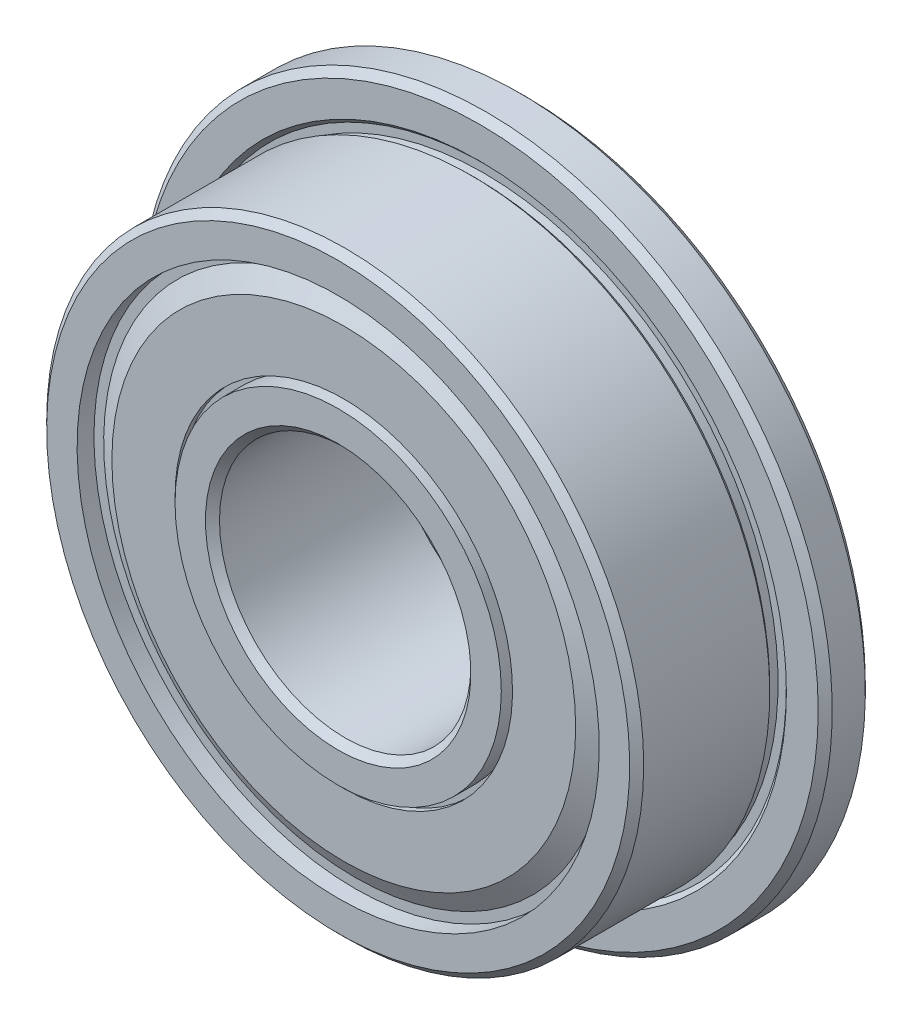
ISO-10303-21;
HEADER;
FILE_DESCRIPTION(('STEP AP214'),'2;1');
FILE_NAME('part.step','',(''),(''),'','','');
FILE_SCHEMA(('AUTOMOTIVE_DESIGN { 1 0 10303 214 1 1 1 1 }'));
ENDSEC;
DATA;
#1=APPLICATION_CONTEXT('core data for automotive mechanical design processes');
#2=APPLICATION_PROTOCOL_DEFINITION('international standard','automotive_design',2000,#1);
#3=PRODUCT_CONTEXT('',#1,'mechanical');
#4=PRODUCT('Part','Part','',(#3));
#5=PRODUCT_RELATED_PRODUCT_CATEGORY('part','',(#4));
#6=PRODUCT_DEFINITION_FORMATION('','',#4);
#7=PRODUCT_DEFINITION_CONTEXT('part definition',#1,'design');
#8=PRODUCT_DEFINITION('design','',#6,#7);
#9=PRODUCT_DEFINITION_SHAPE('','',#8);
#10=(LENGTH_UNIT() NAMED_UNIT(*) SI_UNIT(.MILLI.,.METRE.));
#11=(NAMED_UNIT(*) PLANE_ANGLE_UNIT() SI_UNIT($,.RADIAN.));
#12=(NAMED_UNIT(*) SI_UNIT($,.STERADIAN.) SOLID_ANGLE_UNIT());
#13=UNCERTAINTY_MEASURE_WITH_UNIT(LENGTH_MEASURE(1.E-05),#10,'distance_accuracy_value','');
#14=(GEOMETRIC_REPRESENTATION_CONTEXT(3) GLOBAL_UNCERTAINTY_ASSIGNED_CONTEXT((#13)) GLOBAL_UNIT_ASSIGNED_CONTEXT((#10,
#11,#12)) REPRESENTATION_CONTEXT('',''));
#15=CARTESIAN_POINT('',(0.,0.,0.));
#16=DIRECTION('',(0.,0.,1.));
#17=DIRECTION('',(1.,0.,0.));
#18=AXIS2_PLACEMENT_3D('',#15,#16,#17);
#19=CARTESIAN_POINT('',(0.,0.,0.));
#20=DIRECTION('',(0.,0.,1.));
#21=DIRECTION('',(0.,-1.,0.));
#22=AXIS2_PLACEMENT_3D('',#19,#20,#21);
#23=CYLINDRICAL_SURFACE('',#22,8.30833333333333);
#24=CARTESIAN_POINT('',(0.,0.,-2.285));
#25=DIRECTION('',(0.,0.,1.));
#26=DIRECTION('',(0.,-1.,0.));
#27=AXIS2_PLACEMENT_3D('',#24,#25,#26);
#28=CIRCLE('',#27,8.30833333333333);
#29=CARTESIAN_POINT('',(0.,-8.30833333333333,-2.285));
#30=VERTEX_POINT('',#29);
#31=EDGE_CURVE('E84',#30,#30,#28,.T.);
#32=ORIENTED_EDGE('',*,*,#31,.F.);
#33=EDGE_LOOP('',(#32));
#34=FACE_BOUND('',#33,.T.);
#35=CARTESIAN_POINT('',(0.,0.,-2.46375));
#36=DIRECTION('',(0.,0.,1.));
#37=DIRECTION('',(0.,-1.,0.));
#38=AXIS2_PLACEMENT_3D('',#35,#36,#37);
#39=CIRCLE('',#38,8.30833333333333);
#40=CARTESIAN_POINT('',(0.,-8.30833333333333,-2.46375));
#41=VERTEX_POINT('',#40);
#42=EDGE_CURVE('E12',#41,#41,#39,.T.);
#43=ORIENTED_EDGE('',*,*,#42,.T.);
#44=EDGE_LOOP('',(#43));
#45=FACE_BOUND('',#44,.T.);
#46=ADVANCED_FACE('F56',(#34,#45),#23,.T.);
#47=CARTESIAN_POINT('',(0.,8.30833333333333,-2.46375));
#48=DIRECTION('',(0.,0.,1.));
#49=DIRECTION('',(0.,-1.,0.));
#50=AXIS2_PLACEMENT_3D('',#47,#48,#49);
#51=PLANE('',#50);
#52=ORIENTED_EDGE('',*,*,#42,.F.);
#53=EDGE_LOOP('',(#52));
#54=FACE_BOUND('',#53,.T.);
#55=CARTESIAN_POINT('',(0.,0.,-2.46375));
#56=DIRECTION('',(0.,0.,1.));
#57=DIRECTION('',(0.,-1.,0.));
#58=AXIS2_PLACEMENT_3D('',#55,#56,#57);
#59=CIRCLE('',#58,7.99908639433754);
#60=CARTESIAN_POINT('',(0.,-7.99908639433754,-2.46375));
#61=VERTEX_POINT('',#60);
#62=EDGE_CURVE('E62',#61,#61,#59,.T.);
#63=ORIENTED_EDGE('',*,*,#62,.T.);
#64=EDGE_LOOP('',(#63));
#65=FACE_BOUND('',#64,.T.);
#66=ADVANCED_FACE('F91',(#54,#65),#51,.F.);
#67=CARTESIAN_POINT('',(0.,0.,-2.82125));
#68=DIRECTION('',(0.,0.,1.));
#69=DIRECTION('',(0.,-1.,0.));
#70=AXIS2_PLACEMENT_3D('',#67,#68,#69);
#71=CONICAL_SURFACE('',#70,7.37987823063167,1.0471975511966);
#72=ORIENTED_EDGE('',*,*,#62,.F.);
#73=EDGE_LOOP('',(#72));
#74=FACE_BOUND('',#73,.T.);
#75=CARTESIAN_POINT('',(0.,0.,-2.82125));
#76=DIRECTION('',(0.,0.,1.));
#77=DIRECTION('',(0.,-1.,0.));
#78=AXIS2_PLACEMENT_3D('',#75,#76,#77);
#79=CIRCLE('',#78,7.37987823063167);
#80=CARTESIAN_POINT('',(0.,-7.37987823063167,-2.82125));
#81=VERTEX_POINT('',#80);
#82=EDGE_CURVE('E66',#81,#81,#79,.T.);
#83=ORIENTED_EDGE('',*,*,#82,.T.);
#84=EDGE_LOOP('',(#83));
#85=FACE_BOUND('',#84,.T.);
#86=ADVANCED_FACE('F95',(#74,#85),#71,.T.);
#87=CARTESIAN_POINT('',(0.,7.37987823063167,-2.82125));
#88=DIRECTION('',(0.,0.,1.));
#89=DIRECTION('',(0.,-1.,0.));
#90=AXIS2_PLACEMENT_3D('',#87,#88,#89);
#91=PLANE('',#90);
#92=ORIENTED_EDGE('',*,*,#82,.F.);
#93=EDGE_LOOP('',(#92));
#94=FACE_BOUND('',#93,.T.);
#95=CARTESIAN_POINT('',(0.,0.,-2.82125));
#96=DIRECTION('',(0.,0.,1.));
#97=DIRECTION('',(0.,-1.,0.));
#98=AXIS2_PLACEMENT_3D('',#95,#96,#97);
#99=CIRCLE('',#98,5.37041666666667);
#100=CARTESIAN_POINT('',(0.,-5.37041666666667,-2.82125));
#101=VERTEX_POINT('',#100);
#102=EDGE_CURVE('E70',#101,#101,#99,.T.);
#103=ORIENTED_EDGE('',*,*,#102,.T.);
#104=EDGE_LOOP('',(#103));
#105=FACE_BOUND('',#104,.T.);
#106=ADVANCED_FACE('F100',(#94,#105),#91,.F.);
#107=CARTESIAN_POINT('',(0.,0.,0.));
#108=DIRECTION('',(0.,0.,1.));
#109=DIRECTION('',(0.,-1.,0.));
#110=AXIS2_PLACEMENT_3D('',#107,#108,#109);
#111=CYLINDRICAL_SURFACE('',#110,5.37041666666667);
#112=ORIENTED_EDGE('',*,*,#102,.F.);
#113=EDGE_LOOP('',(#112));
#114=FACE_BOUND('',#113,.T.);
#115=CARTESIAN_POINT('',(0.,0.,-2.6425));
#116=DIRECTION('',(0.,0.,1.));
#117=DIRECTION('',(0.,-1.,0.));
#118=AXIS2_PLACEMENT_3D('',#115,#116,#117);
#119=CIRCLE('',#118,5.37041666666667);
#120=CARTESIAN_POINT('',(0.,-5.37041666666667,-2.6425));
#121=VERTEX_POINT('',#120);
#122=EDGE_CURVE('E75',#121,#121,#119,.T.);
#123=ORIENTED_EDGE('',*,*,#122,.T.);
#124=EDGE_LOOP('',(#123));
#125=FACE_BOUND('',#124,.T.);
#126=ADVANCED_FACE('F106',(#114,#125),#111,.F.);
#127=CARTESIAN_POINT('',(0.,7.3319823124846,-2.6425));
#128=DIRECTION('',(0.,0.,-1.));
#129=DIRECTION('',(0.,1.,0.));
#130=AXIS2_PLACEMENT_3D('',#127,#128,#129);
#131=PLANE('',#130);
#132=ORIENTED_EDGE('',*,*,#122,.F.);
#133=EDGE_LOOP('',(#132));
#134=FACE_BOUND('',#133,.T.);
#135=CARTESIAN_POINT('',(0.,0.,-2.6425));
#136=DIRECTION('',(0.,0.,1.));
#137=DIRECTION('',(0.,-1.,0.));
#138=AXIS2_PLACEMENT_3D('',#135,#136,#137);
#139=CIRCLE('',#138,7.3319823124846);
#140=CARTESIAN_POINT('',(0.,-7.3319823124846,-2.6425));
#141=VERTEX_POINT('',#140);
#142=EDGE_CURVE('E78',#141,#141,#139,.T.);
#143=ORIENTED_EDGE('',*,*,#142,.T.);
#144=EDGE_LOOP('',(#143));
#145=FACE_BOUND('',#144,.T.);
#146=ADVANCED_FACE('F110',(#134,#145),#131,.F.);
#147=CARTESIAN_POINT('',(0.,0.,-2.285));
#148=DIRECTION('',(0.,0.,1.));
#149=DIRECTION('',(0.,-1.,0.));
#150=AXIS2_PLACEMENT_3D('',#147,#148,#149);
#151=CONICAL_SURFACE('',#150,7.95119047619048,1.0471975511966);
#152=ORIENTED_EDGE('',*,*,#142,.F.);
#153=EDGE_LOOP('',(#152));
#154=FACE_BOUND('',#153,.T.);
#155=CARTESIAN_POINT('',(0.,0.,-2.285));
#156=DIRECTION('',(0.,0.,1.));
#157=DIRECTION('',(0.,-1.,0.));
#158=AXIS2_PLACEMENT_3D('',#155,#156,#157);
#159=CIRCLE('',#158,7.95119047619048);
#160=CARTESIAN_POINT('',(0.,-7.95119047619048,-2.285));
#161=VERTEX_POINT('',#160);
#162=EDGE_CURVE('E81',#161,#161,#159,.T.);
#163=ORIENTED_EDGE('',*,*,#162,.T.);
#164=EDGE_LOOP('',(#163));
#165=FACE_BOUND('',#164,.T.);
#166=ADVANCED_FACE('F114',(#154,#165),#151,.F.);
#167=CARTESIAN_POINT('',(0.,8.30833333333333,-2.285));
#168=DIRECTION('',(0.,0.,-1.));
#169=DIRECTION('',(0.,1.,0.));
#170=AXIS2_PLACEMENT_3D('',#167,#168,#169);
#171=PLANE('',#170);
#172=ORIENTED_EDGE('',*,*,#162,.F.);
#173=EDGE_LOOP('',(#172));
#174=FACE_BOUND('',#173,.T.);
#175=ORIENTED_EDGE('',*,*,#31,.T.);
#176=EDGE_LOOP('',(#175));
#177=FACE_BOUND('',#176,.T.);
#178=ADVANCED_FACE('F88',(#174,#177),#171,.F.);
#179=CLOSED_SHELL('',(#46,#66,#86,#106,#126,#146,#166,#178));
#180=MANIFOLD_SOLID_BREP('B2',#179);
#181=CARTESIAN_POINT('',(0.,0.,0.));
#182=DIRECTION('',(0.,0.,1.));
#183=DIRECTION('',(0.,-1.,0.));
#184=AXIS2_PLACEMENT_3D('',#181,#182,#183);
#185=CYLINDRICAL_SURFACE('',#184,8.30833333333333);
#186=CARTESIAN_POINT('',(0.,0.,2.46375));
#187=DIRECTION('',(0.,0.,1.));
#188=DIRECTION('',(0.,-1.,0.));
#189=AXIS2_PLACEMENT_3D('',#186,#187,#188);
#190=CIRCLE('',#189,8.30833333333333);
#191=CARTESIAN_POINT('',(0.,-8.30833333333333,2.46375));
#192=VERTEX_POINT('',#191);
#193=EDGE_CURVE('E55',#192,#192,#190,.T.);
#194=ORIENTED_EDGE('',*,*,#193,.F.);
#195=EDGE_LOOP('',(#194));
#196=FACE_BOUND('',#195,.T.);
#197=CARTESIAN_POINT('',(0.,0.,2.285));
#198=DIRECTION('',(0.,0.,1.));
#199=DIRECTION('',(0.,-1.,0.));
#200=AXIS2_PLACEMENT_3D('',#197,#198,#199);
#201=CIRCLE('',#200,8.30833333333333);
#202=CARTESIAN_POINT('',(0.,-8.30833333333333,2.285));
#203=VERTEX_POINT('',#202);
#204=EDGE_CURVE('E196',#203,#203,#201,.T.);
#205=ORIENTED_EDGE('',*,*,#204,.T.);
#206=EDGE_LOOP('',(#205));
#207=FACE_BOUND('',#206,.T.);
#208=ADVANCED_FACE('F168',(#196,#207),#185,.T.);
#209=CARTESIAN_POINT('',(0.,8.30833333333333,2.46375));
#210=DIRECTION('',(0.,0.,-1.));
#211=DIRECTION('',(0.,1.,0.));
#212=AXIS2_PLACEMENT_3D('',#209,#210,#211);
#213=PLANE('',#212);
#214=CARTESIAN_POINT('',(0.,0.,2.46375));
#215=DIRECTION('',(0.,0.,1.));
#216=DIRECTION('',(0.,-1.,0.));
#217=AXIS2_PLACEMENT_3D('',#214,#215,#216);
#218=CIRCLE('',#217,7.99908639433754);
#219=CARTESIAN_POINT('',(0.,-7.99908639433754,2.46375));
#220=VERTEX_POINT('',#219);
#221=EDGE_CURVE('E174',#220,#220,#218,.T.);
#222=ORIENTED_EDGE('',*,*,#221,.F.);
#223=EDGE_LOOP('',(#222));
#224=FACE_BOUND('',#223,.T.);
#225=ORIENTED_EDGE('',*,*,#193,.T.);
#226=EDGE_LOOP('',(#225));
#227=FACE_BOUND('',#226,.T.);
#228=ADVANCED_FACE('F233',(#224,#227),#213,.F.);
#229=CARTESIAN_POINT('',(0.,0.,2.46375));
#230=DIRECTION('',(0.,0.,-1.));
#231=DIRECTION('',(0.,1.,0.));
#232=AXIS2_PLACEMENT_3D('',#229,#230,#231);
#233=CONICAL_SURFACE('',#232,7.99908639433754,1.0471975511966);
#234=CARTESIAN_POINT('',(0.,0.,2.82125));
#235=DIRECTION('',(0.,0.,1.));
#236=DIRECTION('',(0.,-1.,0.));
#237=AXIS2_PLACEMENT_3D('',#234,#235,#236);
#238=CIRCLE('',#237,7.37987823063167);
#239=CARTESIAN_POINT('',(0.,-7.37987823063167,2.82125));
#240=VERTEX_POINT('',#239);
#241=EDGE_CURVE('E178',#240,#240,#238,.T.);
#242=ORIENTED_EDGE('',*,*,#241,.F.);
#243=EDGE_LOOP('',(#242));
#244=FACE_BOUND('',#243,.T.);
#245=ORIENTED_EDGE('',*,*,#221,.T.);
#246=EDGE_LOOP('',(#245));
#247=FACE_BOUND('',#246,.T.);
#248=ADVANCED_FACE('F228',(#244,#247),#233,.T.);
#249=CARTESIAN_POINT('',(0.,7.37987823063167,2.82125));
#250=DIRECTION('',(0.,0.,-1.));
#251=DIRECTION('',(0.,1.,0.));
#252=AXIS2_PLACEMENT_3D('',#249,#250,#251);
#253=PLANE('',#252);
#254=CARTESIAN_POINT('',(0.,0.,2.82125));
#255=DIRECTION('',(0.,0.,1.));
#256=DIRECTION('',(0.,-1.,0.));
#257=AXIS2_PLACEMENT_3D('',#254,#255,#256);
#258=CIRCLE('',#257,5.37041666666667);
#259=CARTESIAN_POINT('',(0.,-5.37041666666667,2.82125));
#260=VERTEX_POINT('',#259);
#261=EDGE_CURVE('E182',#260,#260,#258,.T.);
#262=ORIENTED_EDGE('',*,*,#261,.F.);
#263=EDGE_LOOP('',(#262));
#264=FACE_BOUND('',#263,.T.);
#265=ORIENTED_EDGE('',*,*,#241,.T.);
#266=EDGE_LOOP('',(#265));
#267=FACE_BOUND('',#266,.T.);
#268=ADVANCED_FACE('F222',(#264,#267),#253,.F.);
#269=CARTESIAN_POINT('',(0.,0.,0.));
#270=DIRECTION('',(0.,0.,1.));
#271=DIRECTION('',(0.,-1.,0.));
#272=AXIS2_PLACEMENT_3D('',#269,#270,#271);
#273=CYLINDRICAL_SURFACE('',#272,5.37041666666667);
#274=CARTESIAN_POINT('',(0.,0.,2.6425));
#275=DIRECTION('',(0.,0.,1.));
#276=DIRECTION('',(0.,-1.,0.));
#277=AXIS2_PLACEMENT_3D('',#274,#275,#276);
#278=CIRCLE('',#277,5.37041666666667);
#279=CARTESIAN_POINT('',(0.,-5.37041666666667,2.6425));
#280=VERTEX_POINT('',#279);
#281=EDGE_CURVE('E187',#280,#280,#278,.T.);
#282=ORIENTED_EDGE('',*,*,#281,.F.);
#283=EDGE_LOOP('',(#282));
#284=FACE_BOUND('',#283,.T.);
#285=ORIENTED_EDGE('',*,*,#261,.T.);
#286=EDGE_LOOP('',(#285));
#287=FACE_BOUND('',#286,.T.);
#288=ADVANCED_FACE('F216',(#284,#287),#273,.F.);
#289=CARTESIAN_POINT('',(0.,7.3319823124846,2.6425));
#290=DIRECTION('',(0.,0.,1.));
#291=DIRECTION('',(0.,-1.,0.));
#292=AXIS2_PLACEMENT_3D('',#289,#290,#291);
#293=PLANE('',#292);
#294=CARTESIAN_POINT('',(0.,0.,2.6425));
#295=DIRECTION('',(0.,0.,1.));
#296=DIRECTION('',(0.,-1.,0.));
#297=AXIS2_PLACEMENT_3D('',#294,#295,#296);
#298=CIRCLE('',#297,7.3319823124846);
#299=CARTESIAN_POINT('',(0.,-7.3319823124846,2.6425));
#300=VERTEX_POINT('',#299);
#301=EDGE_CURVE('E190',#300,#300,#298,.T.);
#302=ORIENTED_EDGE('',*,*,#301,.F.);
#303=EDGE_LOOP('',(#302));
#304=FACE_BOUND('',#303,.T.);
#305=ORIENTED_EDGE('',*,*,#281,.T.);
#306=EDGE_LOOP('',(#305));
#307=FACE_BOUND('',#306,.T.);
#308=ADVANCED_FACE('F210',(#304,#307),#293,.F.);
#309=CARTESIAN_POINT('',(0.,0.,2.6425));
#310=DIRECTION('',(0.,0.,-1.));
#311=DIRECTION('',(0.,1.,0.));
#312=AXIS2_PLACEMENT_3D('',#309,#310,#311);
#313=CONICAL_SURFACE('',#312,7.3319823124846,1.0471975511966);
#314=CARTESIAN_POINT('',(0.,0.,2.285));
#315=DIRECTION('',(0.,0.,1.));
#316=DIRECTION('',(0.,-1.,0.));
#317=AXIS2_PLACEMENT_3D('',#314,#315,#316);
#318=CIRCLE('',#317,7.95119047619048);
#319=CARTESIAN_POINT('',(0.,-7.95119047619048,2.285));
#320=VERTEX_POINT('',#319);
#321=EDGE_CURVE('E193',#320,#320,#318,.T.);
#322=ORIENTED_EDGE('',*,*,#321,.F.);
#323=EDGE_LOOP('',(#322));
#324=FACE_BOUND('',#323,.T.);
#325=ORIENTED_EDGE('',*,*,#301,.T.);
#326=EDGE_LOOP('',(#325));
#327=FACE_BOUND('',#326,.T.);
#328=ADVANCED_FACE('F204',(#324,#327),#313,.F.);
#329=CARTESIAN_POINT('',(0.,8.30833333333333,2.285));
#330=DIRECTION('',(0.,0.,1.));
#331=DIRECTION('',(0.,-1.,0.));
#332=AXIS2_PLACEMENT_3D('',#329,#330,#331);
#333=PLANE('',#332);
#334=ORIENTED_EDGE('',*,*,#204,.F.);
#335=EDGE_LOOP('',(#334));
#336=FACE_BOUND('',#335,.T.);
#337=ORIENTED_EDGE('',*,*,#321,.T.);
#338=EDGE_LOOP('',(#337));
#339=FACE_BOUND('',#338,.T.);
#340=ADVANCED_FACE('F201',(#336,#339),#333,.F.);
#341=CLOSED_SHELL('',(#208,#228,#248,#268,#288,#308,#328,#340));
#342=MANIFOLD_SOLID_BREP('B7',#341);
#343=CARTESIAN_POINT('',(-4.33881636538408,5.17079999105315,0.));
#344=DIRECTION('',(-0.64278760968653,0.766044443118986,0.));
#345=DIRECTION('',(0.766044443118986,0.64278760968653,0.));
#346=AXIS2_PLACEMENT_3D('',#343,#344,#345);
#347=SPHERICAL_SURFACE('',#346,1.5875);
#348=CARTESIAN_POINT('',(-5.35924169576144,6.38689554450454,0.));
#349=VERTEX_POINT('',#348);
#350=VERTEX_LOOP('',#349);
#351=FACE_BOUND('',#350,.T.);
#352=ADVANCED_FACE('F280',(#351),#347,.T.);
#353=CLOSED_SHELL('',(#352));
#354=MANIFOLD_SOLID_BREP('B50',#353);
#355=CARTESIAN_POINT('',(-6.64745233283239,1.17212519925185,0.));
#356=DIRECTION('',(-0.984807753012206,0.17364817766694,0.));
#357=DIRECTION('',(0.17364817766694,0.984807753012206,0.));
#358=AXIS2_PLACEMENT_3D('',#355,#356,#357);
#359=SPHERICAL_SURFACE('',#358,1.5875);
#360=CARTESIAN_POINT('',(-8.21083464073927,1.44779168129812,0.));
#361=VERTEX_POINT('',#360);
#362=VERTEX_LOOP('',#361);
#363=FACE_BOUND('',#362,.T.);
#364=ADVANCED_FACE('F297',(#363),#359,.T.);
#365=CLOSED_SHELL('',(#364));
#366=MANIFOLD_SOLID_BREP('B164',#365);
#367=CARTESIAN_POINT('',(-5.84567147554499,-3.37499999999995,0.));
#368=DIRECTION('',(-0.866025403784443,-0.499999999999992,0.));
#369=DIRECTION('',(-0.499999999999992,0.866025403784443,0.));
#370=AXIS2_PLACEMENT_3D('',#367,#368,#369);
#371=SPHERICAL_SURFACE('',#370,1.5875);
#372=CARTESIAN_POINT('',(-7.22048680405279,-4.16874999999993,0.));
#373=VERTEX_POINT('',#372);
#374=VERTEX_LOOP('',#373);
#375=FACE_BOUND('',#374,.T.);
#376=ADVANCED_FACE('F314',(#375),#371,.T.);
#377=CLOSED_SHELL('',(#376));
#378=MANIFOLD_SOLID_BREP('B276',#377);
#379=CARTESIAN_POINT('',(-2.30863596744831,-6.34292519030486,0.));
#380=DIRECTION('',(-0.342020143325676,-0.939692620785906,0.));
#381=DIRECTION('',(-0.939692620785906,0.342020143325676,0.));
#382=AXIS2_PLACEMENT_3D('',#379,#380,#381);
#383=SPHERICAL_SURFACE('',#382,1.5875);
#384=CARTESIAN_POINT('',(-2.85159294497782,-7.83468722580249,0.));
#385=VERTEX_POINT('',#384);
#386=VERTEX_LOOP('',#385);
#387=FACE_BOUND('',#386,.T.);
#388=ADVANCED_FACE('F331',(#387),#383,.T.);
#389=CLOSED_SHELL('',(#388));
#390=MANIFOLD_SOLID_BREP('B293',#389);
#391=CARTESIAN_POINT('',(2.30863596744823,-6.3429251903049,0.));
#392=DIRECTION('',(0.342020143325663,-0.939692620785911,0.));
#393=DIRECTION('',(-0.939692620785911,-0.342020143325663,0.));
#394=AXIS2_PLACEMENT_3D('',#391,#392,#393);
#395=SPHERICAL_SURFACE('',#394,1.5875);
#396=CARTESIAN_POINT('',(2.85159294497772,-7.83468722580253,0.));
#397=VERTEX_POINT('',#396);
#398=VERTEX_LOOP('',#397);
#399=FACE_BOUND('',#398,.T.);
#400=ADVANCED_FACE('F348',(#399),#395,.T.);
#401=CLOSED_SHELL('',(#400));
#402=MANIFOLD_SOLID_BREP('B310',#401);
#403=CARTESIAN_POINT('',(5.84567147554495,-3.37500000000003,0.));
#404=DIRECTION('',(0.866025403784437,-0.500000000000004,0.));
#405=DIRECTION('',(-0.500000000000004,-0.866025403784437,0.));
#406=AXIS2_PLACEMENT_3D('',#403,#404,#405);
#407=SPHERICAL_SURFACE('',#406,1.5875);
#408=CARTESIAN_POINT('',(7.22048680405274,-4.16875000000003,0.));
#409=VERTEX_POINT('',#408);
#410=VERTEX_LOOP('',#409);
#411=FACE_BOUND('',#410,.T.);
#412=ADVANCED_FACE('F365',(#411),#407,.T.);
#413=CLOSED_SHELL('',(#412));
#414=MANIFOLD_SOLID_BREP('B327',#413);
#415=CARTESIAN_POINT('',(6.64745233283241,1.17212519925176,0.));
#416=DIRECTION('',(0.984807753012209,0.173648177666928,0.));
#417=DIRECTION('',(0.173648177666928,-0.984807753012209,0.));
#418=AXIS2_PLACEMENT_3D('',#415,#416,#417);
#419=SPHERICAL_SURFACE('',#418,1.5875);
#420=CARTESIAN_POINT('',(8.21083464073929,1.44779168129801,0.));
#421=VERTEX_POINT('',#420);
#422=VERTEX_LOOP('',#421);
#423=FACE_BOUND('',#422,.T.);
#424=ADVANCED_FACE('F382',(#423),#419,.T.);
#425=CLOSED_SHELL('',(#424));
#426=MANIFOLD_SOLID_BREP('B344',#425);
#427=CARTESIAN_POINT('',(4.33881636538415,5.1707999910531,0.));
#428=DIRECTION('',(0.64278760968654,0.766044443118977,0.));
#429=DIRECTION('',(0.766044443118977,-0.64278760968654,0.));
#430=AXIS2_PLACEMENT_3D('',#427,#428,#429);
#431=SPHERICAL_SURFACE('',#430,1.5875);
#432=CARTESIAN_POINT('',(5.35924169576153,6.38689554450447,0.));
#433=VERTEX_POINT('',#432);
#434=VERTEX_LOOP('',#433);
#435=FACE_BOUND('',#434,.T.);
#436=ADVANCED_FACE('F399',(#435),#431,.T.);
#437=CLOSED_SHELL('',(#436));
#438=MANIFOLD_SOLID_BREP('B361',#437);
#439=CARTESIAN_POINT('',(0.,6.75,0.));
#440=DIRECTION('',(0.,1.,0.));
#441=DIRECTION('',(1.,0.,0.));
#442=AXIS2_PLACEMENT_3D('',#439,#440,#441);
#443=SPHERICAL_SURFACE('',#442,1.5875);
#444=CARTESIAN_POINT('',(0.,8.3375,0.));
#445=VERTEX_POINT('',#444);
#446=VERTEX_LOOP('',#445);
#447=FACE_BOUND('',#446,.T.);
#448=ADVANCED_FACE('F419',(#447),#443,.T.);
#449=CLOSED_SHELL('',(#448));
#450=MANIFOLD_SOLID_BREP('B378',#449);
#451=CARTESIAN_POINT('',(0.,0.,0.));
#452=DIRECTION('',(0.,0.,1.));
#453=DIRECTION('',(0.,-1.,0.));
#454=AXIS2_PLACEMENT_3D('',#451,#452,#453);
#455=CYLINDRICAL_SURFACE('',#454,5.7875);
#456=CARTESIAN_POINT('',(0.,0.,1.26243811729526));
#457=DIRECTION('',(0.,0.,1.));
#458=DIRECTION('',(0.,-1.,0.));
#459=AXIS2_PLACEMENT_3D('',#456,#457,#458);
#460=CIRCLE('',#459,5.7875);
#461=CARTESIAN_POINT('',(0.,-5.7875,1.26243811729526));
#462=VERTEX_POINT('',#461);
#463=EDGE_CURVE('E462',#462,#462,#460,.T.);
#464=ORIENTED_EDGE('',*,*,#463,.T.);
#465=EDGE_LOOP('',(#464));
#466=FACE_BOUND('',#465,.T.);
#467=CARTESIAN_POINT('',(0.,0.,2.285));
#468=DIRECTION('',(0.,0.,1.));
#469=DIRECTION('',(0.,-1.,0.));
#470=AXIS2_PLACEMENT_3D('',#467,#468,#469);
#471=CIRCLE('',#470,5.7875);
#472=CARTESIAN_POINT('',(0.,-5.7875,2.285));
#473=VERTEX_POINT('',#472);
#474=EDGE_CURVE('E480',#473,#473,#471,.T.);
#475=ORIENTED_EDGE('',*,*,#474,.F.);
#476=EDGE_LOOP('',(#475));
#477=FACE_BOUND('',#476,.T.);
#478=ADVANCED_FACE('F439',(#466,#477),#455,.T.);
#479=CARTESIAN_POINT('',(0.,4.,3.));
#480=DIRECTION('',(0.,0.,-1.));
#481=DIRECTION('',(0.,1.,0.));
#482=AXIS2_PLACEMENT_3D('',#479,#480,#481);
#483=PLANE('',#482);
#484=CARTESIAN_POINT('',(0.,0.,3.));
#485=DIRECTION('',(0.,0.,-1.));
#486=DIRECTION('',(0.,1.,0.));
#487=AXIS2_PLACEMENT_3D('',#484,#485,#486);
#488=CIRCLE('',#487,4.2234375);
#489=CARTESIAN_POINT('',(0.,4.2234375,3.));
#490=VERTEX_POINT('',#489);
#491=EDGE_CURVE('E418',#490,#490,#488,.T.);
#492=ORIENTED_EDGE('',*,*,#491,.T.);
#493=EDGE_LOOP('',(#492));
#494=FACE_BOUND('',#493,.T.);
#495=CARTESIAN_POINT('',(0.,0.,3.));
#496=DIRECTION('',(0.,0.,1.));
#497=DIRECTION('',(0.,-1.,0.));
#498=AXIS2_PLACEMENT_3D('',#495,#496,#497);
#499=CIRCLE('',#498,5.19166666666667);
#500=CARTESIAN_POINT('',(0.,-5.19166666666667,3.));
#501=VERTEX_POINT('',#500);
#502=EDGE_CURVE('E474',#501,#501,#499,.T.);
#503=ORIENTED_EDGE('',*,*,#502,.T.);
#504=EDGE_LOOP('',(#503));
#505=FACE_BOUND('',#504,.T.);
#506=ADVANCED_FACE('F488',(#494,#505),#483,.F.);
#507=CARTESIAN_POINT('',(0.,0.,0.));
#508=DIRECTION('',(0.,0.,1.));
#509=DIRECTION('',(0.,-1.,0.));
#510=AXIS2_PLACEMENT_3D('',#507,#508,#509);
#511=CYLINDRICAL_SURFACE('',#510,5.7875);
#512=CARTESIAN_POINT('',(0.,0.,-1.26243811729526));
#513=DIRECTION('',(0.,0.,1.));
#514=DIRECTION('',(0.,-1.,0.));
#515=AXIS2_PLACEMENT_3D('',#512,#513,#514);
#516=CIRCLE('',#515,5.7875);
#517=CARTESIAN_POINT('',(0.,-5.7875,-1.26243811729526));
#518=VERTEX_POINT('',#517);
#519=EDGE_CURVE('E459',#518,#518,#516,.T.);
#520=ORIENTED_EDGE('',*,*,#519,.F.);
#521=EDGE_LOOP('',(#520));
#522=FACE_BOUND('',#521,.T.);
#523=CARTESIAN_POINT('',(0.,0.,-2.285));
#524=DIRECTION('',(0.,0.,1.));
#525=DIRECTION('',(0.,-1.,0.));
#526=AXIS2_PLACEMENT_3D('',#523,#524,#525);
#527=CIRCLE('',#526,5.7875);
#528=CARTESIAN_POINT('',(0.,-5.7875,-2.285));
#529=VERTEX_POINT('',#528);
#530=EDGE_CURVE('E471',#529,#529,#527,.T.);
#531=ORIENTED_EDGE('',*,*,#530,.T.);
#532=EDGE_LOOP('',(#531));
#533=FACE_BOUND('',#532,.T.);
#534=ADVANCED_FACE('F495',(#522,#533),#511,.T.);
#535=CARTESIAN_POINT('',(0.,5.7875,-3.));
#536=DIRECTION('',(0.,0.,1.));
#537=DIRECTION('',(0.,-1.,0.));
#538=AXIS2_PLACEMENT_3D('',#535,#536,#537);
#539=PLANE('',#538);
#540=CARTESIAN_POINT('',(0.,0.,-3.));
#541=DIRECTION('',(0.,0.,1.));
#542=DIRECTION('',(0.,-1.,0.));
#543=AXIS2_PLACEMENT_3D('',#540,#541,#542);
#544=CIRCLE('',#543,4.2234375);
#545=CARTESIAN_POINT('',(0.,-4.2234375,-3.));
#546=VERTEX_POINT('',#545);
#547=EDGE_CURVE('E454',#546,#546,#544,.T.);
#548=ORIENTED_EDGE('',*,*,#547,.T.);
#549=EDGE_LOOP('',(#548));
#550=FACE_BOUND('',#549,.T.);
#551=CARTESIAN_POINT('',(0.,0.,-3.));
#552=DIRECTION('',(0.,0.,1.));
#553=DIRECTION('',(0.,-1.,0.));
#554=AXIS2_PLACEMENT_3D('',#551,#552,#553);
#555=CIRCLE('',#554,5.19166666666667);
#556=CARTESIAN_POINT('',(0.,-5.19166666666667,-3.));
#557=VERTEX_POINT('',#556);
#558=EDGE_CURVE('E465',#557,#557,#555,.T.);
#559=ORIENTED_EDGE('',*,*,#558,.F.);
#560=EDGE_LOOP('',(#559));
#561=FACE_BOUND('',#560,.T.);
#562=ADVANCED_FACE('F503',(#550,#561),#539,.F.);
#563=CARTESIAN_POINT('',(0.,0.,0.));
#564=DIRECTION('',(0.,0.,1.));
#565=DIRECTION('',(0.,-1.,0.));
#566=AXIS2_PLACEMENT_3D('',#563,#564,#565);
#567=TOROIDAL_SURFACE('',#566,6.75,1.5875);
#568=ORIENTED_EDGE('',*,*,#463,.F.);
#569=EDGE_LOOP('',(#568));
#570=FACE_BOUND('',#569,.T.);
#571=ORIENTED_EDGE('',*,*,#519,.T.);
#572=EDGE_LOOP('',(#571));
#573=FACE_BOUND('',#572,.T.);
#574=ADVANCED_FACE('F499',(#570,#573),#567,.F.);
#575=CARTESIAN_POINT('',(0.,0.,0.));
#576=DIRECTION('',(0.,0.,1.));
#577=DIRECTION('',(0.,-1.,0.));
#578=AXIS2_PLACEMENT_3D('',#575,#576,#577);
#579=CYLINDRICAL_SURFACE('',#578,4.);
#580=CARTESIAN_POINT('',(0.,0.,-2.7765625));
#581=DIRECTION('',(0.,0.,1.));
#582=DIRECTION('',(0.,-1.,0.));
#583=AXIS2_PLACEMENT_3D('',#580,#581,#582);
#584=CIRCLE('',#583,4.);
#585=CARTESIAN_POINT('',(0.,-4.,-2.7765625));
#586=VERTEX_POINT('',#585);
#587=EDGE_CURVE('E446',#586,#586,#584,.F.);
#588=ORIENTED_EDGE('',*,*,#587,.T.);
#589=EDGE_LOOP('',(#588));
#590=FACE_BOUND('',#589,.T.);
#591=CARTESIAN_POINT('',(0.,0.,2.7765625));
#592=DIRECTION('',(0.,0.,-1.));
#593=DIRECTION('',(0.,1.,0.));
#594=AXIS2_PLACEMENT_3D('',#591,#592,#593);
#595=CIRCLE('',#594,4.);
#596=CARTESIAN_POINT('',(0.,4.,2.7765625));
#597=VERTEX_POINT('',#596);
#598=EDGE_CURVE('E450',#597,#597,#595,.F.);
#599=ORIENTED_EDGE('',*,*,#598,.T.);
#600=EDGE_LOOP('',(#599));
#601=FACE_BOUND('',#600,.T.);
#602=ADVANCED_FACE('F502',(#590,#601),#579,.F.);
#603=CARTESIAN_POINT('',(0.,0.,-3.));
#604=DIRECTION('',(0.,0.,-1.));
#605=DIRECTION('',(0.,1.,0.));
#606=AXIS2_PLACEMENT_3D('',#603,#604,#605);
#607=CONICAL_SURFACE('',#606,4.2234375,0.785398163397448);
#608=ORIENTED_EDGE('',*,*,#587,.F.);
#609=EDGE_LOOP('',(#608));
#610=FACE_BOUND('',#609,.T.);
#611=ORIENTED_EDGE('',*,*,#547,.F.);
#612=EDGE_LOOP('',(#611));
#613=FACE_BOUND('',#612,.T.);
#614=ADVANCED_FACE('F507',(#610,#613),#607,.F.);
#615=CARTESIAN_POINT('',(0.,0.,2.7765625));
#616=DIRECTION('',(0.,0.,1.));
#617=DIRECTION('',(0.,-1.,0.));
#618=AXIS2_PLACEMENT_3D('',#615,#616,#617);
#619=CONICAL_SURFACE('',#618,4.,0.785398163397448);
#620=ORIENTED_EDGE('',*,*,#491,.F.);
#621=EDGE_LOOP('',(#620));
#622=FACE_BOUND('',#621,.T.);
#623=ORIENTED_EDGE('',*,*,#598,.F.);
#624=EDGE_LOOP('',(#623));
#625=FACE_BOUND('',#624,.T.);
#626=ADVANCED_FACE('F441',(#622,#625),#619,.F.);
#627=CARTESIAN_POINT('',(0.,0.,0.));
#628=DIRECTION('',(0.,0.,1.));
#629=DIRECTION('',(0.,-1.,0.));
#630=AXIS2_PLACEMENT_3D('',#627,#628,#629);
#631=CYLINDRICAL_SURFACE('',#630,5.19166666666667);
#632=ORIENTED_EDGE('',*,*,#558,.T.);
#633=EDGE_LOOP('',(#632));
#634=FACE_BOUND('',#633,.T.);
#635=CARTESIAN_POINT('',(0.,0.,-2.285));
#636=DIRECTION('',(0.,0.,1.));
#637=DIRECTION('',(0.,-1.,0.));
#638=AXIS2_PLACEMENT_3D('',#635,#636,#637);
#639=CIRCLE('',#638,5.19166666666667);
#640=CARTESIAN_POINT('',(0.,-5.19166666666667,-2.285));
#641=VERTEX_POINT('',#640);
#642=EDGE_CURVE('E468',#641,#641,#639,.T.);
#643=ORIENTED_EDGE('',*,*,#642,.F.);
#644=EDGE_LOOP('',(#643));
#645=FACE_BOUND('',#644,.T.);
#646=ADVANCED_FACE('F513',(#634,#645),#631,.T.);
#647=CARTESIAN_POINT('',(0.,5.7875,-2.285));
#648=DIRECTION('',(0.,0.,-1.));
#649=DIRECTION('',(0.,1.,0.));
#650=AXIS2_PLACEMENT_3D('',#647,#648,#649);
#651=PLANE('',#650);
#652=ORIENTED_EDGE('',*,*,#642,.T.);
#653=EDGE_LOOP('',(#652));
#654=FACE_BOUND('',#653,.T.);
#655=ORIENTED_EDGE('',*,*,#530,.F.);
#656=EDGE_LOOP('',(#655));
#657=FACE_BOUND('',#656,.T.);
#658=ADVANCED_FACE('F525',(#654,#657),#651,.T.);
#659=CARTESIAN_POINT('',(0.,0.,0.));
#660=DIRECTION('',(0.,0.,1.));
#661=DIRECTION('',(0.,-1.,0.));
#662=AXIS2_PLACEMENT_3D('',#659,#660,#661);
#663=CYLINDRICAL_SURFACE('',#662,5.19166666666667);
#664=CARTESIAN_POINT('',(0.,0.,2.285));
#665=DIRECTION('',(0.,0.,1.));
#666=DIRECTION('',(0.,-1.,0.));
#667=AXIS2_PLACEMENT_3D('',#664,#665,#666);
#668=CIRCLE('',#667,5.19166666666667);
#669=CARTESIAN_POINT('',(0.,-5.19166666666667,2.285));
#670=VERTEX_POINT('',#669);
#671=EDGE_CURVE('E477',#670,#670,#668,.T.);
#672=ORIENTED_EDGE('',*,*,#671,.T.);
#673=EDGE_LOOP('',(#672));
#674=FACE_BOUND('',#673,.T.);
#675=ORIENTED_EDGE('',*,*,#502,.F.);
#676=EDGE_LOOP('',(#675));
#677=FACE_BOUND('',#676,.T.);
#678=ADVANCED_FACE('F531',(#674,#677),#663,.T.);
#679=CARTESIAN_POINT('',(0.,5.7875,2.285));
#680=DIRECTION('',(0.,0.,1.));
#681=DIRECTION('',(0.,-1.,0.));
#682=AXIS2_PLACEMENT_3D('',#679,#680,#681);
#683=PLANE('',#682);
#684=ORIENTED_EDGE('',*,*,#474,.T.);
#685=EDGE_LOOP('',(#684));
#686=FACE_BOUND('',#685,.T.);
#687=ORIENTED_EDGE('',*,*,#671,.F.);
#688=EDGE_LOOP('',(#687));
#689=FACE_BOUND('',#688,.T.);
#690=ADVANCED_FACE('F484',(#686,#689),#683,.T.);
#691=CLOSED_SHELL('',(#478,#506,#534,#562,#574,#602,#614,#626,#646,#658,#678,#690));
#692=MANIFOLD_SOLID_BREP('B395',#691);
#693=CARTESIAN_POINT('',(0.,7.7125,-3.));
#694=DIRECTION('',(0.,0.,1.));
#695=DIRECTION('',(0.,-1.,0.));
#696=AXIS2_PLACEMENT_3D('',#693,#694,#695);
#697=PLANE('',#696);
#698=CARTESIAN_POINT('',(0.,0.,-3.));
#699=DIRECTION('',(0.,0.,1.));
#700=DIRECTION('',(0.,-1.,0.));
#701=AXIS2_PLACEMENT_3D('',#698,#699,#700);
#702=CIRCLE('',#701,10.7765625);
#703=CARTESIAN_POINT('',(0.,-10.7765625,-3.));
#704=VERTEX_POINT('',#703);
#705=EDGE_CURVE('E616',#704,#704,#702,.F.);
#706=ORIENTED_EDGE('',*,*,#705,.T.);
#707=EDGE_LOOP('',(#706));
#708=FACE_BOUND('',#707,.T.);
#709=CARTESIAN_POINT('',(0.,0.,-3.));
#710=DIRECTION('',(0.,0.,1.));
#711=DIRECTION('',(0.,-1.,0.));
#712=AXIS2_PLACEMENT_3D('',#709,#710,#711);
#713=CIRCLE('',#712,8.30833333333333);
#714=CARTESIAN_POINT('',(0.,-8.30833333333333,-3.));
#715=VERTEX_POINT('',#714);
#716=EDGE_CURVE('E670',#715,#715,#713,.T.);
#717=ORIENTED_EDGE('',*,*,#716,.T.);
#718=EDGE_LOOP('',(#717));
#719=FACE_BOUND('',#718,.T.);
#720=ADVANCED_FACE('F598',(#708,#719),#697,.F.);
#721=CARTESIAN_POINT('',(0.,0.,0.));
#722=DIRECTION('',(0.,0.,1.));
#723=DIRECTION('',(0.,-1.,0.));
#724=AXIS2_PLACEMENT_3D('',#721,#722,#723);
#725=CYLINDRICAL_SURFACE('',#724,7.7125);
#726=CARTESIAN_POINT('',(0.,0.,-1.26243811729526));
#727=DIRECTION('',(0.,0.,1.));
#728=DIRECTION('',(0.,-1.,0.));
#729=AXIS2_PLACEMENT_3D('',#726,#727,#728);
#730=CIRCLE('',#729,7.7125);
#731=CARTESIAN_POINT('',(0.,-7.7125,-1.26243811729526));
#732=VERTEX_POINT('',#731);
#733=EDGE_CURVE('E630',#732,#732,#730,.T.);
#734=ORIENTED_EDGE('',*,*,#733,.T.);
#735=EDGE_LOOP('',(#734));
#736=FACE_BOUND('',#735,.T.);
#737=CARTESIAN_POINT('',(0.,0.,-2.285));
#738=DIRECTION('',(0.,0.,1.));
#739=DIRECTION('',(0.,-1.,0.));
#740=AXIS2_PLACEMENT_3D('',#737,#738,#739);
#741=CIRCLE('',#740,7.7125);
#742=CARTESIAN_POINT('',(0.,-7.7125,-2.285));
#743=VERTEX_POINT('',#742);
#744=EDGE_CURVE('E678',#743,#743,#741,.T.);
#745=ORIENTED_EDGE('',*,*,#744,.F.);
#746=EDGE_LOOP('',(#745));
#747=FACE_BOUND('',#746,.T.);
#748=ADVANCED_FACE('F686',(#736,#747),#725,.F.);
#749=CARTESIAN_POINT('',(0.,0.,0.));
#750=DIRECTION('',(0.,0.,1.));
#751=DIRECTION('',(0.,-1.,0.));
#752=AXIS2_PLACEMENT_3D('',#749,#750,#751);
#753=CYLINDRICAL_SURFACE('',#752,7.7125);
#754=CARTESIAN_POINT('',(0.,0.,1.26243811729526));
#755=DIRECTION('',(0.,0.,1.));
#756=DIRECTION('',(0.,-1.,0.));
#757=AXIS2_PLACEMENT_3D('',#754,#755,#756);
#758=CIRCLE('',#757,7.7125);
#759=CARTESIAN_POINT('',(0.,-7.7125,1.26243811729526));
#760=VERTEX_POINT('',#759);
#761=EDGE_CURVE('E634',#760,#760,#758,.T.);
#762=ORIENTED_EDGE('',*,*,#761,.F.);
#763=EDGE_LOOP('',(#762));
#764=FACE_BOUND('',#763,.T.);
#765=CARTESIAN_POINT('',(0.,0.,2.285));
#766=DIRECTION('',(0.,0.,1.));
#767=DIRECTION('',(0.,-1.,0.));
#768=AXIS2_PLACEMENT_3D('',#765,#766,#767);
#769=CIRCLE('',#768,7.7125);
#770=CARTESIAN_POINT('',(0.,-7.7125,2.285));
#771=VERTEX_POINT('',#770);
#772=EDGE_CURVE('E666',#771,#771,#769,.T.);
#773=ORIENTED_EDGE('',*,*,#772,.T.);
#774=EDGE_LOOP('',(#773));
#775=FACE_BOUND('',#774,.T.);
#776=ADVANCED_FACE('F688',(#764,#775),#753,.F.);
#777=CARTESIAN_POINT('',(0.,9.5,3.));
#778=DIRECTION('',(0.,0.,-1.));
#779=DIRECTION('',(0.,1.,0.));
#780=AXIS2_PLACEMENT_3D('',#777,#778,#779);
#781=PLANE('',#780);
#782=CARTESIAN_POINT('',(0.,0.,3.));
#783=DIRECTION('',(0.,0.,-1.));
#784=DIRECTION('',(0.,1.,0.));
#785=AXIS2_PLACEMENT_3D('',#782,#783,#784);
#786=CIRCLE('',#785,9.2765625);
#787=CARTESIAN_POINT('',(0.,9.2765625,3.));
#788=VERTEX_POINT('',#787);
#789=EDGE_CURVE('E606',#788,#788,#786,.F.);
#790=ORIENTED_EDGE('',*,*,#789,.T.);
#791=EDGE_LOOP('',(#790));
#792=FACE_BOUND('',#791,.T.);
#793=CARTESIAN_POINT('',(0.,0.,3.));
#794=DIRECTION('',(0.,0.,1.));
#795=DIRECTION('',(0.,-1.,0.));
#796=AXIS2_PLACEMENT_3D('',#793,#794,#795);
#797=CIRCLE('',#796,8.30833333333333);
#798=CARTESIAN_POINT('',(0.,-8.30833333333333,3.));
#799=VERTEX_POINT('',#798);
#800=EDGE_CURVE('E658',#799,#799,#797,.T.);
#801=ORIENTED_EDGE('',*,*,#800,.F.);
#802=EDGE_LOOP('',(#801));
#803=FACE_BOUND('',#802,.T.);
#804=ADVANCED_FACE('F695',(#792,#803),#781,.F.);
#805=CARTESIAN_POINT('',(0.,0.,0.));
#806=DIRECTION('',(0.,0.,1.));
#807=DIRECTION('',(0.,-1.,0.));
#808=AXIS2_PLACEMENT_3D('',#805,#806,#807);
#809=TOROIDAL_SURFACE('',#808,6.75,1.5875);
#810=ORIENTED_EDGE('',*,*,#733,.F.);
#811=EDGE_LOOP('',(#810));
#812=FACE_BOUND('',#811,.T.);
#813=ORIENTED_EDGE('',*,*,#761,.T.);
#814=EDGE_LOOP('',(#813));
#815=FACE_BOUND('',#814,.T.);
#816=ADVANCED_FACE('F701',(#812,#815),#809,.F.);
#817=CARTESIAN_POINT('',(0.,0.,0.));
#818=DIRECTION('',(0.,0.,1.));
#819=DIRECTION('',(0.,-1.,0.));
#820=AXIS2_PLACEMENT_3D('',#817,#818,#819);
#821=CYLINDRICAL_SURFACE('',#820,9.5);
#822=CARTESIAN_POINT('',(0.,0.,2.7765625));
#823=DIRECTION('',(0.,0.,-1.));
#824=DIRECTION('',(0.,1.,0.));
#825=AXIS2_PLACEMENT_3D('',#822,#823,#824);
#826=CIRCLE('',#825,9.5);
#827=CARTESIAN_POINT('',(0.,9.5,2.7765625));
#828=VERTEX_POINT('',#827);
#829=EDGE_CURVE('E438',#828,#828,#826,.T.);
#830=ORIENTED_EDGE('',*,*,#829,.T.);
#831=EDGE_LOOP('',(#830));
#832=FACE_BOUND('',#831,.T.);
#833=CARTESIAN_POINT('',(0.,0.,-1.23483495705504));
#834=DIRECTION('',(0.,0.,1.));
#835=DIRECTION('',(0.,-1.,0.));
#836=AXIS2_PLACEMENT_3D('',#833,#834,#835);
#837=CIRCLE('',#836,9.5);
#838=CARTESIAN_POINT('',(0.,-9.5,-1.23483495705504));
#839=VERTEX_POINT('',#838);
#840=EDGE_CURVE('E638',#839,#839,#837,.T.);
#841=ORIENTED_EDGE('',*,*,#840,.T.);
#842=EDGE_LOOP('',(#841));
#843=FACE_BOUND('',#842,.T.);
#844=ADVANCED_FACE('F746',(#832,#843),#821,.T.);
#845=CARTESIAN_POINT('',(0.,0.,-1.36741747852752));
#846=DIRECTION('',(0.,0.,1.));
#847=DIRECTION('',(0.,-1.,0.));
#848=AXIS2_PLACEMENT_3D('',#845,#846,#847);
#849=CONICAL_SURFACE('',#848,9.36741747852752,0.785398163397439);
#850=ORIENTED_EDGE('',*,*,#840,.F.);
#851=EDGE_LOOP('',(#850));
#852=FACE_BOUND('',#851,.T.);
#853=CARTESIAN_POINT('',(0.,0.,-1.36741747852752));
#854=DIRECTION('',(0.,0.,1.));
#855=DIRECTION('',(0.,-1.,0.));
#856=AXIS2_PLACEMENT_3D('',#853,#854,#855);
#857=CIRCLE('',#856,9.36741747852752);
#858=CARTESIAN_POINT('',(0.,-9.36741747852752,-1.36741747852752));
#859=VERTEX_POINT('',#858);
#860=EDGE_CURVE('E642',#859,#859,#857,.T.);
#861=ORIENTED_EDGE('',*,*,#860,.T.);
#862=EDGE_LOOP('',(#861));
#863=FACE_BOUND('',#862,.T.);
#864=ADVANCED_FACE('F742',(#852,#863),#849,.T.);
#865=CARTESIAN_POINT('',(0.,0.,0.));
#866=DIRECTION('',(0.,0.,1.));
#867=DIRECTION('',(0.,-1.,0.));
#868=AXIS2_PLACEMENT_3D('',#865,#866,#867);
#869=CYLINDRICAL_SURFACE('',#868,9.36741747852752);
#870=ORIENTED_EDGE('',*,*,#860,.F.);
#871=EDGE_LOOP('',(#870));
#872=FACE_BOUND('',#871,.T.);
#873=CARTESIAN_POINT('',(0.,0.,-1.63258252147248));
#874=DIRECTION('',(0.,0.,1.));
#875=DIRECTION('',(0.,-1.,0.));
#876=AXIS2_PLACEMENT_3D('',#873,#874,#875);
#877=CIRCLE('',#876,9.36741747852752);
#878=CARTESIAN_POINT('',(0.,-9.36741747852752,-1.63258252147248));
#879=VERTEX_POINT('',#878);
#880=EDGE_CURVE('E646',#879,#879,#877,.T.);
#881=ORIENTED_EDGE('',*,*,#880,.T.);
#882=EDGE_LOOP('',(#881));
#883=FACE_BOUND('',#882,.T.);
#884=ADVANCED_FACE('F734',(#872,#883),#869,.T.);
#885=CARTESIAN_POINT('',(0.,9.63258252147248,-1.63258252147248));
#886=DIRECTION('',(0.,0.,-1.));
#887=DIRECTION('',(0.,1.,0.));
#888=AXIS2_PLACEMENT_3D('',#885,#886,#887);
#889=PLANE('',#888);
#890=ORIENTED_EDGE('',*,*,#880,.F.);
#891=EDGE_LOOP('',(#890));
#892=FACE_BOUND('',#891,.T.);
#893=CARTESIAN_POINT('',(0.,0.,-1.63258252147248));
#894=DIRECTION('',(0.,0.,1.));
#895=DIRECTION('',(0.,-1.,0.));
#896=AXIS2_PLACEMENT_3D('',#893,#894,#895);
#897=CIRCLE('',#896,9.63258252147248);
#898=CARTESIAN_POINT('',(0.,-9.63258252147248,-1.63258252147248));
#899=VERTEX_POINT('',#898);
#900=EDGE_CURVE('E650',#899,#899,#897,.T.);
#901=ORIENTED_EDGE('',*,*,#900,.T.);
#902=EDGE_LOOP('',(#901));
#903=FACE_BOUND('',#902,.T.);
#904=ADVANCED_FACE('F727',(#892,#903),#889,.F.);
#905=CARTESIAN_POINT('',(0.,0.,-1.5));
#906=DIRECTION('',(0.,0.,1.));
#907=DIRECTION('',(0.,-1.,0.));
#908=AXIS2_PLACEMENT_3D('',#905,#906,#907);
#909=CONICAL_SURFACE('',#908,9.76516504294495,0.785398163397448);
#910=ORIENTED_EDGE('',*,*,#900,.F.);
#911=EDGE_LOOP('',(#910));
#912=FACE_BOUND('',#911,.T.);
#913=CARTESIAN_POINT('',(0.,0.,-1.5));
#914=DIRECTION('',(0.,0.,1.));
#915=DIRECTION('',(0.,-1.,0.));
#916=AXIS2_PLACEMENT_3D('',#913,#914,#915);
#917=CIRCLE('',#916,9.76516504294495);
#918=CARTESIAN_POINT('',(0.,-9.76516504294495,-1.5));
#919=VERTEX_POINT('',#918);
#920=EDGE_CURVE('E654',#919,#919,#917,.T.);
#921=ORIENTED_EDGE('',*,*,#920,.T.);
#922=EDGE_LOOP('',(#921));
#923=FACE_BOUND('',#922,.T.);
#924=ADVANCED_FACE('F722',(#912,#923),#909,.F.);
#925=CARTESIAN_POINT('',(0.,11.,-1.5));
#926=DIRECTION('',(0.,0.,-1.));
#927=DIRECTION('',(0.,1.,0.));
#928=AXIS2_PLACEMENT_3D('',#925,#926,#927);
#929=PLANE('',#928);
#930=CARTESIAN_POINT('',(0.,0.,-1.5));
#931=DIRECTION('',(0.,0.,-1.));
#932=DIRECTION('',(0.,1.,0.));
#933=AXIS2_PLACEMENT_3D('',#930,#931,#932);
#934=CIRCLE('',#933,10.7765625);
#935=CARTESIAN_POINT('',(0.,10.7765625,-1.5));
#936=VERTEX_POINT('',#935);
#937=EDGE_CURVE('E611',#936,#936,#934,.F.);
#938=ORIENTED_EDGE('',*,*,#937,.T.);
#939=EDGE_LOOP('',(#938));
#940=FACE_BOUND('',#939,.T.);
#941=ORIENTED_EDGE('',*,*,#920,.F.);
#942=EDGE_LOOP('',(#941));
#943=FACE_BOUND('',#942,.T.);
#944=ADVANCED_FACE('F719',(#940,#943),#929,.F.);
#945=CARTESIAN_POINT('',(0.,0.,0.));
#946=DIRECTION('',(0.,0.,1.));
#947=DIRECTION('',(0.,-1.,0.));
#948=AXIS2_PLACEMENT_3D('',#945,#946,#947);
#949=CYLINDRICAL_SURFACE('',#948,11.);
#950=CARTESIAN_POINT('',(0.,0.,-2.7765625));
#951=DIRECTION('',(0.,0.,1.));
#952=DIRECTION('',(0.,-1.,0.));
#953=AXIS2_PLACEMENT_3D('',#950,#951,#952);
#954=CIRCLE('',#953,11.);
#955=CARTESIAN_POINT('',(0.,-11.,-2.7765625));
#956=VERTEX_POINT('',#955);
#957=EDGE_CURVE('E622',#956,#956,#954,.T.);
#958=ORIENTED_EDGE('',*,*,#957,.T.);
#959=EDGE_LOOP('',(#958));
#960=FACE_BOUND('',#959,.T.);
#961=CARTESIAN_POINT('',(0.,0.,-1.7234375));
#962=DIRECTION('',(0.,0.,-1.));
#963=DIRECTION('',(0.,1.,0.));
#964=AXIS2_PLACEMENT_3D('',#961,#962,#963);
#965=CIRCLE('',#964,11.);
#966=CARTESIAN_POINT('',(0.,11.,-1.7234375));
#967=VERTEX_POINT('',#966);
#968=EDGE_CURVE('E626',#967,#967,#965,.T.);
#969=ORIENTED_EDGE('',*,*,#968,.T.);
#970=EDGE_LOOP('',(#969));
#971=FACE_BOUND('',#970,.T.);
#972=ADVANCED_FACE('F706',(#960,#971),#949,.T.);
#973=CARTESIAN_POINT('',(0.,0.,-2.7765625));
#974=DIRECTION('',(0.,0.,1.));
#975=DIRECTION('',(0.,-1.,0.));
#976=AXIS2_PLACEMENT_3D('',#973,#974,#975);
#977=CONICAL_SURFACE('',#976,11.,0.785398163397448);
#978=ORIENTED_EDGE('',*,*,#705,.F.);
#979=EDGE_LOOP('',(#978));
#980=FACE_BOUND('',#979,.T.);
#981=ORIENTED_EDGE('',*,*,#957,.F.);
#982=EDGE_LOOP('',(#981));
#983=FACE_BOUND('',#982,.T.);
#984=ADVANCED_FACE('F703',(#980,#983),#977,.T.);
#985=CARTESIAN_POINT('',(0.,0.,-1.5));
#986=DIRECTION('',(0.,0.,-1.));
#987=DIRECTION('',(0.,1.,0.));
#988=AXIS2_PLACEMENT_3D('',#985,#986,#987);
#989=CONICAL_SURFACE('',#988,10.7765625,0.785398163397448);
#990=ORIENTED_EDGE('',*,*,#968,.F.);
#991=EDGE_LOOP('',(#990));
#992=FACE_BOUND('',#991,.T.);
#993=ORIENTED_EDGE('',*,*,#937,.F.);
#994=EDGE_LOOP('',(#993));
#995=FACE_BOUND('',#994,.T.);
#996=ADVANCED_FACE('F705',(#992,#995),#989,.T.);
#997=CARTESIAN_POINT('',(0.,0.,3.));
#998=DIRECTION('',(0.,0.,-1.));
#999=DIRECTION('',(0.,1.,0.));
#1000=AXIS2_PLACEMENT_3D('',#997,#998,#999);
#1001=CONICAL_SURFACE('',#1000,9.2765625,0.785398163397448);
#1002=ORIENTED_EDGE('',*,*,#829,.F.);
#1003=EDGE_LOOP('',(#1002));
#1004=FACE_BOUND('',#1003,.T.);
#1005=ORIENTED_EDGE('',*,*,#789,.F.);
#1006=EDGE_LOOP('',(#1005));
#1007=FACE_BOUND('',#1006,.T.);
#1008=ADVANCED_FACE('F600',(#1004,#1007),#1001,.T.);
#1009=CARTESIAN_POINT('',(0.,0.,0.));
#1010=DIRECTION('',(0.,0.,1.));
#1011=DIRECTION('',(0.,-1.,0.));
#1012=AXIS2_PLACEMENT_3D('',#1009,#1010,#1011);
#1013=CYLINDRICAL_SURFACE('',#1012,8.30833333333333);
#1014=ORIENTED_EDGE('',*,*,#800,.T.);
#1015=EDGE_LOOP('',(#1014));
#1016=FACE_BOUND('',#1015,.T.);
#1017=CARTESIAN_POINT('',(0.,0.,2.285));
#1018=DIRECTION('',(0.,0.,1.));
#1019=DIRECTION('',(0.,-1.,0.));
#1020=AXIS2_PLACEMENT_3D('',#1017,#1018,#1019);
#1021=CIRCLE('',#1020,8.30833333333333);
#1022=CARTESIAN_POINT('',(0.,-8.30833333333333,2.285));
#1023=VERTEX_POINT('',#1022);
#1024=EDGE_CURVE('E662',#1023,#1023,#1021,.T.);
#1025=ORIENTED_EDGE('',*,*,#1024,.F.);
#1026=EDGE_LOOP('',(#1025));
#1027=FACE_BOUND('',#1026,.T.);
#1028=ADVANCED_FACE('F713',(#1016,#1027),#1013,.F.);
#1029=CARTESIAN_POINT('',(0.,7.7125,2.285));
#1030=DIRECTION('',(0.,0.,1.));
#1031=DIRECTION('',(0.,-1.,0.));
#1032=AXIS2_PLACEMENT_3D('',#1029,#1030,#1031);
#1033=PLANE('',#1032);
#1034=ORIENTED_EDGE('',*,*,#1024,.T.);
#1035=EDGE_LOOP('',(#1034));
#1036=FACE_BOUND('',#1035,.T.);
#1037=ORIENTED_EDGE('',*,*,#772,.F.);
#1038=EDGE_LOOP('',(#1037));
#1039=FACE_BOUND('',#1038,.T.);
#1040=ADVANCED_FACE('F759',(#1036,#1039),#1033,.T.);
#1041=CARTESIAN_POINT('',(0.,0.,0.));
#1042=DIRECTION('',(0.,0.,1.));
#1043=DIRECTION('',(0.,-1.,0.));
#1044=AXIS2_PLACEMENT_3D('',#1041,#1042,#1043);
#1045=CYLINDRICAL_SURFACE('',#1044,8.30833333333333);
#1046=CARTESIAN_POINT('',(0.,0.,-2.285));
#1047=DIRECTION('',(0.,0.,1.));
#1048=DIRECTION('',(0.,-1.,0.));
#1049=AXIS2_PLACEMENT_3D('',#1046,#1047,#1048);
#1050=CIRCLE('',#1049,8.30833333333333);
#1051=CARTESIAN_POINT('',(0.,-8.30833333333333,-2.285));
#1052=VERTEX_POINT('',#1051);
#1053=EDGE_CURVE('E674',#1052,#1052,#1050,.T.);
#1054=ORIENTED_EDGE('',*,*,#1053,.T.);
#1055=EDGE_LOOP('',(#1054));
#1056=FACE_BOUND('',#1055,.T.);
#1057=ORIENTED_EDGE('',*,*,#716,.F.);
#1058=EDGE_LOOP('',(#1057));
#1059=FACE_BOUND('',#1058,.T.);
#1060=ADVANCED_FACE('F765',(#1056,#1059),#1045,.F.);
#1061=CARTESIAN_POINT('',(0.,7.7125,-2.285));
#1062=DIRECTION('',(0.,0.,-1.));
#1063=DIRECTION('',(0.,1.,0.));
#1064=AXIS2_PLACEMENT_3D('',#1061,#1062,#1063);
#1065=PLANE('',#1064);
#1066=ORIENTED_EDGE('',*,*,#744,.T.);
#1067=EDGE_LOOP('',(#1066));
#1068=FACE_BOUND('',#1067,.T.);
#1069=ORIENTED_EDGE('',*,*,#1053,.F.);
#1070=EDGE_LOOP('',(#1069));
#1071=FACE_BOUND('',#1070,.T.);
#1072=ADVANCED_FACE('F683',(#1068,#1071),#1065,.T.);
#1073=CLOSED_SHELL('',(#720,#748,#776,#804,#816,#844,#864,#884,#904,#924,#944,#972,#984,#996,
#1008,#1028,#1040,#1060,#1072));
#1074=MANIFOLD_SOLID_BREP('B413',#1073);
#1075=ADVANCED_BREP_SHAPE_REPRESENTATION('',(#18,#180,#342,#354,#366,#378,#390,#402,#414,#426,
#438,#450,#692,#1074),#14);
#1076=SHAPE_DEFINITION_REPRESENTATION(#9,#1075);
ENDSEC;
END-ISO-10303-21;
